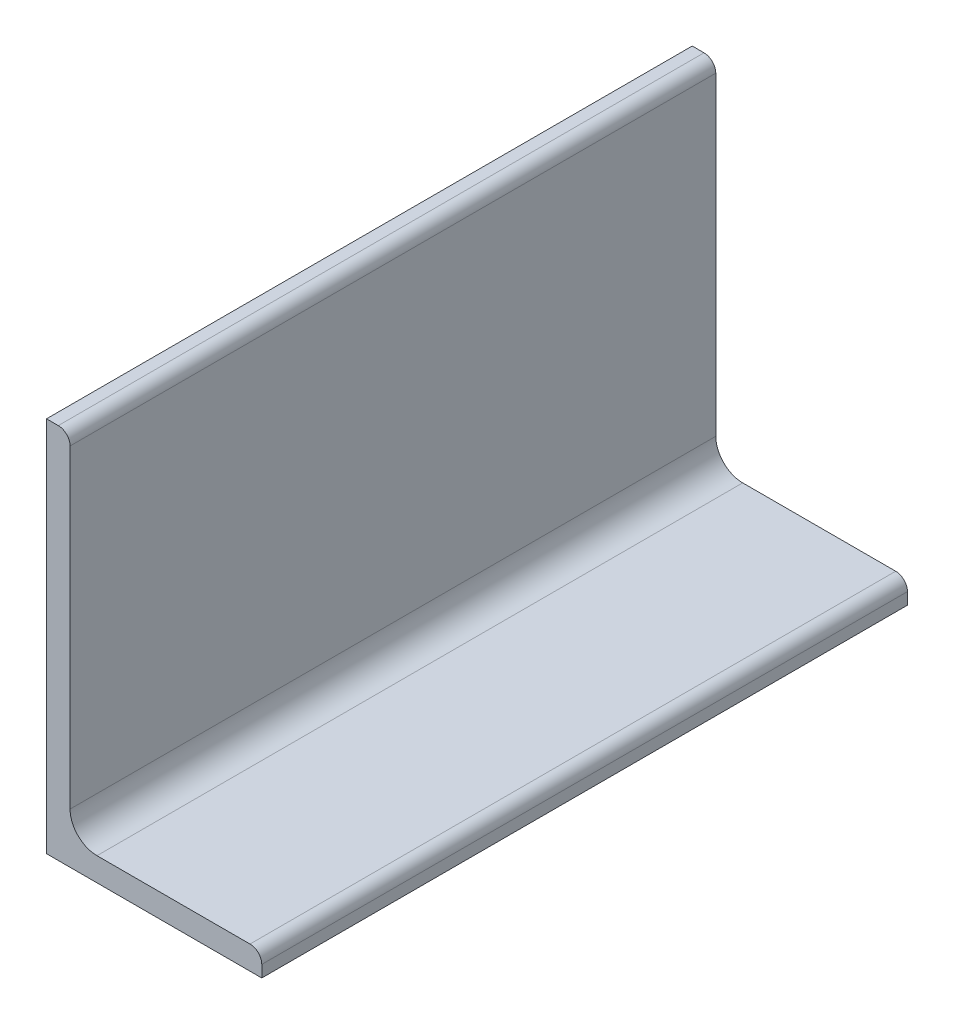
ISO-10303-21;
HEADER;
FILE_DESCRIPTION(('STEP AP214'),'2;1');
FILE_NAME('part.step','',(''),(''),'','','');
FILE_SCHEMA(('AUTOMOTIVE_DESIGN { 1 0 10303 214 1 1 1 1 }'));
ENDSEC;
DATA;
#1=APPLICATION_CONTEXT('core data for automotive mechanical design processes');
#2=APPLICATION_PROTOCOL_DEFINITION('international standard','automotive_design',2000,#1);
#3=PRODUCT_CONTEXT('',#1,'mechanical');
#4=PRODUCT('Part','Part','',(#3));
#5=PRODUCT_RELATED_PRODUCT_CATEGORY('part','',(#4));
#6=PRODUCT_DEFINITION_FORMATION('','',#4);
#7=PRODUCT_DEFINITION_CONTEXT('part definition',#1,'design');
#8=PRODUCT_DEFINITION('design','',#6,#7);
#9=PRODUCT_DEFINITION_SHAPE('','',#8);
#10=(LENGTH_UNIT() NAMED_UNIT(*) SI_UNIT(.MILLI.,.METRE.));
#11=(NAMED_UNIT(*) PLANE_ANGLE_UNIT() SI_UNIT($,.RADIAN.));
#12=(NAMED_UNIT(*) SI_UNIT($,.STERADIAN.) SOLID_ANGLE_UNIT());
#13=UNCERTAINTY_MEASURE_WITH_UNIT(LENGTH_MEASURE(1.E-05),#10,'distance_accuracy_value','');
#14=(GEOMETRIC_REPRESENTATION_CONTEXT(3) GLOBAL_UNCERTAINTY_ASSIGNED_CONTEXT((#13)) GLOBAL_UNIT_ASSIGNED_CONTEXT((#10,
#11,#12)) REPRESENTATION_CONTEXT('',''));
#15=CARTESIAN_POINT('',(0.,0.,0.));
#16=DIRECTION('',(0.,0.,1.));
#17=DIRECTION('',(1.,0.,0.));
#18=AXIS2_PLACEMENT_3D('',#15,#16,#17);
#19=CARTESIAN_POINT('',(0.865045893659089,178.809200992538,304.8));
#20=DIRECTION('',(1.,0.,0.));
#21=DIRECTION('',(0.,0.,-1.));
#22=AXIS2_PLACEMENT_3D('',#19,#20,#21);
#23=PLANE('',#22);
#24=DIRECTION('',(0.,-1.,0.));
#25=VECTOR('',#24,1.);
#26=CARTESIAN_POINT('',(0.865045893659089,178.809200992538,0.));
#27=LINE('',#26,#25);
#28=CARTESIAN_POINT('',(0.865045893659089,178.809200992538,0.));
#29=VERTEX_POINT('',#28);
#30=CARTESIAN_POINT('',(0.865045893659089,1.00920099253849,0.));
#31=VERTEX_POINT('',#30);
#32=EDGE_CURVE('E135',#29,#31,#27,.T.);
#33=ORIENTED_EDGE('',*,*,#32,.T.);
#34=DIRECTION('',(0.,0.,-1.));
#35=VECTOR('',#34,1.);
#36=CARTESIAN_POINT('',(0.865045893659089,1.00920099253849,304.8));
#37=LINE('',#36,#35);
#38=CARTESIAN_POINT('',(0.865045893659089,1.00920099253849,304.8));
#39=VERTEX_POINT('',#38);
#40=EDGE_CURVE('E11',#39,#31,#37,.T.);
#41=ORIENTED_EDGE('',*,*,#40,.F.);
#42=DIRECTION('',(0.,-1.,0.));
#43=VECTOR('',#42,1.);
#44=CARTESIAN_POINT('',(0.865045893659089,178.809200992538,304.8));
#45=LINE('',#44,#43);
#46=CARTESIAN_POINT('',(0.865045893659089,178.809200992538,304.8));
#47=VERTEX_POINT('',#46);
#48=EDGE_CURVE('E151',#47,#39,#45,.T.);
#49=ORIENTED_EDGE('',*,*,#48,.F.);
#50=DIRECTION('',(0.,0.,-1.));
#51=VECTOR('',#50,1.);
#52=CARTESIAN_POINT('',(0.865045893659089,178.809200992538,304.8));
#53=LINE('',#52,#51);
#54=EDGE_CURVE('E131',#47,#29,#53,.T.);
#55=ORIENTED_EDGE('',*,*,#54,.T.);
#56=EDGE_LOOP('',(#33,#41,#49,#55));
#57=FACE_BOUND('',#56,.T.);
#58=ADVANCED_FACE('F33',(#57),#23,.F.);
#59=CARTESIAN_POINT('',(0.865045893659089,1.00920099253849,304.8));
#60=DIRECTION('',(0.,1.,0.));
#61=DIRECTION('',(0.,0.,1.));
#62=AXIS2_PLACEMENT_3D('',#59,#60,#61);
#63=PLANE('',#62);
#64=DIRECTION('',(1.,0.,0.));
#65=VECTOR('',#64,1.);
#66=CARTESIAN_POINT('',(0.865045893659089,1.00920099253849,0.));
#67=LINE('',#66,#65);
#68=CARTESIAN_POINT('',(102.465045893659,1.00920099253849,0.));
#69=VERTEX_POINT('',#68);
#70=EDGE_CURVE('E138',#31,#69,#67,.T.);
#71=ORIENTED_EDGE('',*,*,#70,.T.);
#72=DIRECTION('',(0.,0.,-1.));
#73=VECTOR('',#72,1.);
#74=CARTESIAN_POINT('',(102.465045893659,1.00920099253849,304.8));
#75=LINE('',#74,#73);
#76=CARTESIAN_POINT('',(102.465045893659,1.00920099253849,304.8));
#77=VERTEX_POINT('',#76);
#78=EDGE_CURVE('E41',#77,#69,#75,.T.);
#79=ORIENTED_EDGE('',*,*,#78,.F.);
#80=DIRECTION('',(1.,0.,0.));
#81=VECTOR('',#80,1.);
#82=CARTESIAN_POINT('',(0.865045893659089,1.00920099253849,304.8));
#83=LINE('',#82,#81);
#84=EDGE_CURVE('E95',#39,#77,#83,.T.);
#85=ORIENTED_EDGE('',*,*,#84,.F.);
#86=ORIENTED_EDGE('',*,*,#40,.T.);
#87=EDGE_LOOP('',(#71,#79,#85,#86));
#88=FACE_BOUND('',#87,.T.);
#89=ADVANCED_FACE('F194',(#88),#63,.F.);
#90=CARTESIAN_POINT('',(102.465045893659,1.00920099253849,304.8));
#91=DIRECTION('',(-1.,0.,0.));
#92=DIRECTION('',(0.,0.,1.));
#93=AXIS2_PLACEMENT_3D('',#90,#91,#92);
#94=PLANE('',#93);
#95=DIRECTION('',(0.,1.,0.));
#96=VECTOR('',#95,1.);
#97=CARTESIAN_POINT('',(102.465045893659,1.00920099253849,0.));
#98=LINE('',#97,#96);
#99=CARTESIAN_POINT('',(102.465045893659,6.56545099253849,0.));
#100=VERTEX_POINT('',#99);
#101=EDGE_CURVE('E140',#69,#100,#98,.T.);
#102=ORIENTED_EDGE('',*,*,#101,.T.);
#103=DIRECTION('',(0.,0.,-1.));
#104=VECTOR('',#103,1.);
#105=CARTESIAN_POINT('',(102.465045893659,6.56545099253849,304.8));
#106=LINE('',#105,#104);
#107=CARTESIAN_POINT('',(102.465045893659,6.56545099253849,304.8));
#108=VERTEX_POINT('',#107);
#109=EDGE_CURVE('E161',#108,#100,#106,.T.);
#110=ORIENTED_EDGE('',*,*,#109,.F.);
#111=DIRECTION('',(0.,1.,0.));
#112=VECTOR('',#111,1.);
#113=CARTESIAN_POINT('',(102.465045893659,1.00920099253849,304.8));
#114=LINE('',#113,#112);
#115=EDGE_CURVE('E169',#77,#108,#114,.T.);
#116=ORIENTED_EDGE('',*,*,#115,.F.);
#117=ORIENTED_EDGE('',*,*,#78,.T.);
#118=EDGE_LOOP('',(#102,#110,#116,#117));
#119=FACE_BOUND('',#118,.T.);
#120=ADVANCED_FACE('F167',(#119),#94,.F.);
#121=CARTESIAN_POINT('',(96.9087958936591,6.56545099253849,304.8));
#122=DIRECTION('',(0.,0.,-1.));
#123=DIRECTION('',(-1.,0.,0.));
#124=AXIS2_PLACEMENT_3D('',#121,#122,#123);
#125=CYLINDRICAL_SURFACE('',#124,5.55625000000001);
#126=CARTESIAN_POINT('',(96.9087958936591,6.56545099253849,0.));
#127=DIRECTION('',(0.,0.,1.));
#128=DIRECTION('',(1.,0.,0.));
#129=AXIS2_PLACEMENT_3D('',#126,#127,#128);
#130=CIRCLE('',#129,5.55625000000001);
#131=CARTESIAN_POINT('',(96.9087958936591,12.1217009925385,0.));
#132=VERTEX_POINT('',#131);
#133=EDGE_CURVE('E142',#100,#132,#130,.T.);
#134=ORIENTED_EDGE('',*,*,#133,.T.);
#135=DIRECTION('',(0.,0.,-1.));
#136=VECTOR('',#135,1.);
#137=CARTESIAN_POINT('',(96.9087958936591,12.1217009925385,304.8));
#138=LINE('',#137,#136);
#139=CARTESIAN_POINT('',(96.9087958936591,12.1217009925385,304.8));
#140=VERTEX_POINT('',#139);
#141=EDGE_CURVE('E158',#140,#132,#138,.T.);
#142=ORIENTED_EDGE('',*,*,#141,.F.);
#143=CARTESIAN_POINT('',(96.9087958936591,6.56545099253849,304.8));
#144=DIRECTION('',(0.,0.,1.));
#145=DIRECTION('',(1.,0.,0.));
#146=AXIS2_PLACEMENT_3D('',#143,#144,#145);
#147=CIRCLE('',#146,5.55625000000001);
#148=EDGE_CURVE('E185',#108,#140,#147,.T.);
#149=ORIENTED_EDGE('',*,*,#148,.F.);
#150=ORIENTED_EDGE('',*,*,#109,.T.);
#151=EDGE_LOOP('',(#134,#142,#149,#150));
#152=FACE_BOUND('',#151,.T.);
#153=ADVANCED_FACE('F178',(#152),#125,.T.);
#154=CARTESIAN_POINT('',(96.9087958936591,12.1217009925385,304.8));
#155=DIRECTION('',(0.,-1.,0.));
#156=DIRECTION('',(0.,0.,-1.));
#157=AXIS2_PLACEMENT_3D('',#154,#155,#156);
#158=PLANE('',#157);
#159=DIRECTION('',(-1.,0.,0.));
#160=VECTOR('',#159,1.);
#161=CARTESIAN_POINT('',(96.9087958936591,12.1217009925385,0.));
#162=LINE('',#161,#160);
#163=CARTESIAN_POINT('',(24.6775458936591,12.1217009925385,0.));
#164=VERTEX_POINT('',#163);
#165=EDGE_CURVE('E144',#132,#164,#162,.T.);
#166=ORIENTED_EDGE('',*,*,#165,.T.);
#167=DIRECTION('',(0.,0.,-1.));
#168=VECTOR('',#167,1.);
#169=CARTESIAN_POINT('',(24.6775458936591,12.1217009925385,304.8));
#170=LINE('',#169,#168);
#171=CARTESIAN_POINT('',(24.6775458936591,12.1217009925385,304.8));
#172=VERTEX_POINT('',#171);
#173=EDGE_CURVE('E155',#172,#164,#170,.T.);
#174=ORIENTED_EDGE('',*,*,#173,.F.);
#175=DIRECTION('',(-1.,0.,0.));
#176=VECTOR('',#175,1.);
#177=CARTESIAN_POINT('',(96.9087958936591,12.1217009925385,304.8));
#178=LINE('',#177,#176);
#179=EDGE_CURVE('E184',#140,#172,#178,.T.);
#180=ORIENTED_EDGE('',*,*,#179,.F.);
#181=ORIENTED_EDGE('',*,*,#141,.T.);
#182=EDGE_LOOP('',(#166,#174,#180,#181));
#183=FACE_BOUND('',#182,.T.);
#184=ADVANCED_FACE('F182',(#183),#158,.F.);
#185=CARTESIAN_POINT('',(24.6775458936591,24.8217009925385,304.8));
#186=DIRECTION('',(0.,0.,-1.));
#187=DIRECTION('',(-1.,0.,0.));
#188=AXIS2_PLACEMENT_3D('',#185,#186,#187);
#189=CYLINDRICAL_SURFACE('',#188,12.7);
#190=CARTESIAN_POINT('',(24.6775458936591,24.8217009925385,0.));
#191=DIRECTION('',(0.,0.,-1.));
#192=DIRECTION('',(1.,0.,0.));
#193=AXIS2_PLACEMENT_3D('',#190,#191,#192);
#194=CIRCLE('',#193,12.7);
#195=CARTESIAN_POINT('',(11.9775458936591,24.8217009925385,0.));
#196=VERTEX_POINT('',#195);
#197=EDGE_CURVE('E146',#164,#196,#194,.T.);
#198=ORIENTED_EDGE('',*,*,#197,.T.);
#199=DIRECTION('',(0.,0.,-1.));
#200=VECTOR('',#199,1.);
#201=CARTESIAN_POINT('',(11.9775458936591,24.8217009925385,304.8));
#202=LINE('',#201,#200);
#203=CARTESIAN_POINT('',(11.9775458936591,24.8217009925385,304.8));
#204=VERTEX_POINT('',#203);
#205=EDGE_CURVE('E126',#204,#196,#202,.T.);
#206=ORIENTED_EDGE('',*,*,#205,.F.);
#207=CARTESIAN_POINT('',(24.6775458936591,24.8217009925385,304.8));
#208=DIRECTION('',(0.,0.,-1.));
#209=DIRECTION('',(1.,0.,0.));
#210=AXIS2_PLACEMENT_3D('',#207,#208,#209);
#211=CIRCLE('',#210,12.7);
#212=EDGE_CURVE('E117',#172,#204,#211,.T.);
#213=ORIENTED_EDGE('',*,*,#212,.F.);
#214=ORIENTED_EDGE('',*,*,#173,.T.);
#215=EDGE_LOOP('',(#198,#206,#213,#214));
#216=FACE_BOUND('',#215,.T.);
#217=ADVANCED_FACE('F206',(#216),#189,.F.);
#218=CARTESIAN_POINT('',(11.9775458936591,24.8217009925385,304.8));
#219=DIRECTION('',(-1.,0.,0.));
#220=DIRECTION('',(0.,0.,1.));
#221=AXIS2_PLACEMENT_3D('',#218,#219,#220);
#222=PLANE('',#221);
#223=DIRECTION('',(0.,1.,0.));
#224=VECTOR('',#223,1.);
#225=CARTESIAN_POINT('',(11.9775458936591,24.8217009925385,0.));
#226=LINE('',#225,#224);
#227=CARTESIAN_POINT('',(11.9775458936591,173.252950992538,0.));
#228=VERTEX_POINT('',#227);
#229=EDGE_CURVE('E125',#196,#228,#226,.T.);
#230=ORIENTED_EDGE('',*,*,#229,.T.);
#231=DIRECTION('',(0.,0.,-1.));
#232=VECTOR('',#231,1.);
#233=CARTESIAN_POINT('',(11.9775458936591,173.252950992538,304.8));
#234=LINE('',#233,#232);
#235=CARTESIAN_POINT('',(11.9775458936591,173.252950992538,304.8));
#236=VERTEX_POINT('',#235);
#237=EDGE_CURVE('E122',#236,#228,#234,.T.);
#238=ORIENTED_EDGE('',*,*,#237,.F.);
#239=DIRECTION('',(0.,1.,0.));
#240=VECTOR('',#239,1.);
#241=CARTESIAN_POINT('',(11.9775458936591,24.8217009925385,304.8));
#242=LINE('',#241,#240);
#243=EDGE_CURVE('E111',#204,#236,#242,.T.);
#244=ORIENTED_EDGE('',*,*,#243,.F.);
#245=ORIENTED_EDGE('',*,*,#205,.T.);
#246=EDGE_LOOP('',(#230,#238,#244,#245));
#247=FACE_BOUND('',#246,.T.);
#248=ADVANCED_FACE('F123',(#247),#222,.F.);
#249=CARTESIAN_POINT('',(6.42129589365909,173.252950992538,304.8));
#250=DIRECTION('',(0.,0.,-1.));
#251=DIRECTION('',(-1.,0.,0.));
#252=AXIS2_PLACEMENT_3D('',#249,#250,#251);
#253=CYLINDRICAL_SURFACE('',#252,5.55624999999999);
#254=CARTESIAN_POINT('',(6.42129589365909,173.252950992538,0.));
#255=DIRECTION('',(0.,0.,1.));
#256=DIRECTION('',(1.,0.,0.));
#257=AXIS2_PLACEMENT_3D('',#254,#255,#256);
#258=CIRCLE('',#257,5.55624999999999);
#259=CARTESIAN_POINT('',(6.42129589365909,178.809200992538,0.));
#260=VERTEX_POINT('',#259);
#261=EDGE_CURVE('E81',#228,#260,#258,.T.);
#262=ORIENTED_EDGE('',*,*,#261,.T.);
#263=DIRECTION('',(0.,0.,-1.));
#264=VECTOR('',#263,1.);
#265=CARTESIAN_POINT('',(6.42129589365909,178.809200992538,304.8));
#266=LINE('',#265,#264);
#267=CARTESIAN_POINT('',(6.42129589365909,178.809200992538,304.8));
#268=VERTEX_POINT('',#267);
#269=EDGE_CURVE('E127',#268,#260,#266,.T.);
#270=ORIENTED_EDGE('',*,*,#269,.F.);
#271=CARTESIAN_POINT('',(6.42129589365909,173.252950992538,304.8));
#272=DIRECTION('',(0.,0.,1.));
#273=DIRECTION('',(1.,0.,0.));
#274=AXIS2_PLACEMENT_3D('',#271,#272,#273);
#275=CIRCLE('',#274,5.55624999999999);
#276=EDGE_CURVE('E115',#236,#268,#275,.T.);
#277=ORIENTED_EDGE('',*,*,#276,.F.);
#278=ORIENTED_EDGE('',*,*,#237,.T.);
#279=EDGE_LOOP('',(#262,#270,#277,#278));
#280=FACE_BOUND('',#279,.T.);
#281=ADVANCED_FACE('F129',(#280),#253,.T.);
#282=CARTESIAN_POINT('',(6.42129589365909,178.809200992538,304.8));
#283=DIRECTION('',(0.,-1.,0.));
#284=DIRECTION('',(0.,0.,-1.));
#285=AXIS2_PLACEMENT_3D('',#282,#283,#284);
#286=PLANE('',#285);
#287=DIRECTION('',(-1.,0.,0.));
#288=VECTOR('',#287,1.);
#289=CARTESIAN_POINT('',(6.42129589365909,178.809200992538,0.));
#290=LINE('',#289,#288);
#291=EDGE_CURVE('E87',#260,#29,#290,.T.);
#292=ORIENTED_EDGE('',*,*,#291,.T.);
#293=ORIENTED_EDGE('',*,*,#54,.F.);
#294=DIRECTION('',(-1.,0.,0.));
#295=VECTOR('',#294,1.);
#296=CARTESIAN_POINT('',(6.42129589365909,178.809200992538,304.8));
#297=LINE('',#296,#295);
#298=EDGE_CURVE('E49',#268,#47,#297,.T.);
#299=ORIENTED_EDGE('',*,*,#298,.F.);
#300=ORIENTED_EDGE('',*,*,#269,.T.);
#301=EDGE_LOOP('',(#292,#293,#299,#300));
#302=FACE_BOUND('',#301,.T.);
#303=ADVANCED_FACE('F214',(#302),#286,.F.);
#304=CARTESIAN_POINT('',(96.9087958936591,6.56545099253849,304.8));
#305=DIRECTION('',(0.,0.,1.));
#306=DIRECTION('',(1.,0.,0.));
#307=AXIS2_PLACEMENT_3D('',#304,#305,#306);
#308=PLANE('',#307);
#309=ORIENTED_EDGE('',*,*,#48,.T.);
#310=ORIENTED_EDGE('',*,*,#84,.T.);
#311=ORIENTED_EDGE('',*,*,#115,.T.);
#312=ORIENTED_EDGE('',*,*,#148,.T.);
#313=ORIENTED_EDGE('',*,*,#179,.T.);
#314=ORIENTED_EDGE('',*,*,#212,.T.);
#315=ORIENTED_EDGE('',*,*,#243,.T.);
#316=ORIENTED_EDGE('',*,*,#276,.T.);
#317=ORIENTED_EDGE('',*,*,#298,.T.);
#318=EDGE_LOOP('',(#309,#310,#311,#312,#313,#314,#315,#316,#317));
#319=FACE_BOUND('',#318,.T.);
#320=ADVANCED_FACE('F113',(#319),#308,.T.);
#321=CARTESIAN_POINT('',(96.9087958936591,6.56545099253849,0.));
#322=DIRECTION('',(0.,0.,1.));
#323=DIRECTION('',(1.,0.,0.));
#324=AXIS2_PLACEMENT_3D('',#321,#322,#323);
#325=PLANE('',#324);
#326=ORIENTED_EDGE('',*,*,#32,.F.);
#327=ORIENTED_EDGE('',*,*,#291,.F.);
#328=ORIENTED_EDGE('',*,*,#261,.F.);
#329=ORIENTED_EDGE('',*,*,#229,.F.);
#330=ORIENTED_EDGE('',*,*,#197,.F.);
#331=ORIENTED_EDGE('',*,*,#165,.F.);
#332=ORIENTED_EDGE('',*,*,#133,.F.);
#333=ORIENTED_EDGE('',*,*,#101,.F.);
#334=ORIENTED_EDGE('',*,*,#70,.F.);
#335=EDGE_LOOP('',(#326,#327,#328,#329,#330,#331,#332,#333,#334));
#336=FACE_BOUND('',#335,.T.);
#337=ADVANCED_FACE('F173',(#336),#325,.F.);
#338=CLOSED_SHELL('',(#58,#89,#120,#153,#184,#217,#248,#281,#303,#320,#337));
#339=MANIFOLD_SOLID_BREP('B2',#338);
#340=ADVANCED_BREP_SHAPE_REPRESENTATION('',(#18,#339),#14);
#341=SHAPE_DEFINITION_REPRESENTATION(#9,#340);
ENDSEC;
END-ISO-10303-21;
